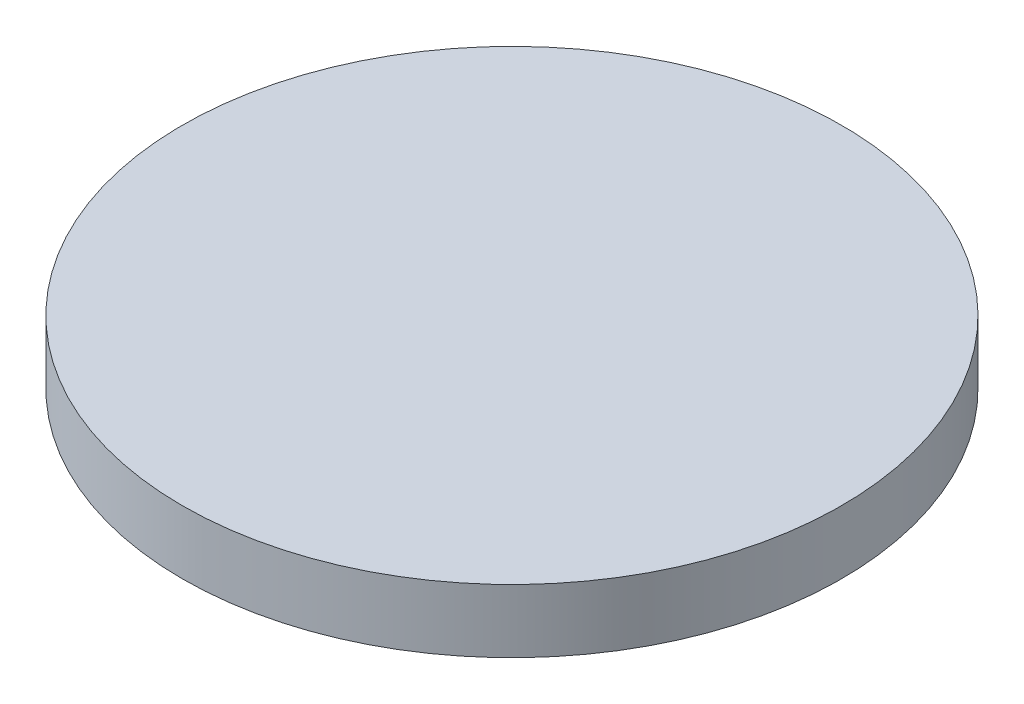
ISO-10303-21;
HEADER;
FILE_DESCRIPTION(('STEP AP214'),'2;1');
FILE_NAME('part.step','',(''),(''),'','','');
FILE_SCHEMA(('AUTOMOTIVE_DESIGN { 1 0 10303 214 1 1 1 1 }'));
ENDSEC;
DATA;
#1=APPLICATION_CONTEXT('core data for automotive mechanical design processes');
#2=APPLICATION_PROTOCOL_DEFINITION('international standard','automotive_design',2000,#1);
#3=PRODUCT_CONTEXT('',#1,'mechanical');
#4=PRODUCT('Part','Part','',(#3));
#5=PRODUCT_RELATED_PRODUCT_CATEGORY('part','',(#4));
#6=PRODUCT_DEFINITION_FORMATION('','',#4);
#7=PRODUCT_DEFINITION_CONTEXT('part definition',#1,'design');
#8=PRODUCT_DEFINITION('design','',#6,#7);
#9=PRODUCT_DEFINITION_SHAPE('','',#8);
#10=(LENGTH_UNIT() NAMED_UNIT(*) SI_UNIT(.MILLI.,.METRE.));
#11=(NAMED_UNIT(*) PLANE_ANGLE_UNIT() SI_UNIT($,.RADIAN.));
#12=(NAMED_UNIT(*) SI_UNIT($,.STERADIAN.) SOLID_ANGLE_UNIT());
#13=UNCERTAINTY_MEASURE_WITH_UNIT(LENGTH_MEASURE(1.E-05),#10,'distance_accuracy_value','');
#14=(GEOMETRIC_REPRESENTATION_CONTEXT(3) GLOBAL_UNCERTAINTY_ASSIGNED_CONTEXT((#13)) GLOBAL_UNIT_ASSIGNED_CONTEXT((#10,
#11,#12)) REPRESENTATION_CONTEXT('',''));
#15=CARTESIAN_POINT('',(0.,0.,0.));
#16=DIRECTION('',(0.,0.,1.));
#17=DIRECTION('',(1.,0.,0.));
#18=AXIS2_PLACEMENT_3D('',#15,#16,#17);
#19=CARTESIAN_POINT('',(0.,16.4,0.));
#20=DIRECTION('',(0.,-1.,0.));
#21=DIRECTION('',(0.,0.,-1.));
#22=AXIS2_PLACEMENT_3D('',#19,#20,#21);
#23=CYLINDRICAL_SURFACE('',#22,26.);
#24=CARTESIAN_POINT('',(0.,16.4,0.));
#25=DIRECTION('',(0.,1.,0.));
#26=DIRECTION('',(0.,0.,1.));
#27=AXIS2_PLACEMENT_3D('',#24,#25,#26);
#28=CIRCLE('',#27,26.);
#29=CARTESIAN_POINT('',(0.,16.4,26.));
#30=VERTEX_POINT('',#29);
#31=EDGE_CURVE('E11',#30,#30,#28,.T.);
#32=ORIENTED_EDGE('',*,*,#31,.F.);
#33=EDGE_LOOP('',(#32));
#34=FACE_BOUND('',#33,.T.);
#35=CARTESIAN_POINT('',(0.,11.4,0.));
#36=DIRECTION('',(0.,1.,0.));
#37=DIRECTION('',(0.,0.,1.));
#38=AXIS2_PLACEMENT_3D('',#35,#36,#37);
#39=CIRCLE('',#38,26.);
#40=CARTESIAN_POINT('',(0.,11.4,26.));
#41=VERTEX_POINT('',#40);
#42=EDGE_CURVE('E52',#41,#41,#39,.T.);
#43=ORIENTED_EDGE('',*,*,#42,.T.);
#44=EDGE_LOOP('',(#43));
#45=FACE_BOUND('',#44,.T.);
#46=ADVANCED_FACE('F49',(#34,#45),#23,.T.);
#47=CARTESIAN_POINT('',(0.,16.4,0.));
#48=DIRECTION('',(0.,1.,0.));
#49=DIRECTION('',(0.,0.,1.));
#50=AXIS2_PLACEMENT_3D('',#47,#48,#49);
#51=PLANE('',#50);
#52=ORIENTED_EDGE('',*,*,#31,.T.);
#53=EDGE_LOOP('',(#52));
#54=FACE_BOUND('',#53,.T.);
#55=ADVANCED_FACE('F64',(#54),#51,.T.);
#56=CARTESIAN_POINT('',(0.,11.4,0.));
#57=DIRECTION('',(0.,1.,0.));
#58=DIRECTION('',(0.,0.,1.));
#59=AXIS2_PLACEMENT_3D('',#56,#57,#58);
#60=PLANE('',#59);
#61=ORIENTED_EDGE('',*,*,#42,.F.);
#62=EDGE_LOOP('',(#61));
#63=FACE_BOUND('',#62,.T.);
#64=ADVANCED_FACE('F62',(#63),#60,.F.);
#65=CLOSED_SHELL('',(#46,#55,#64));
#66=MANIFOLD_SOLID_BREP('B2',#65);
#67=CARTESIAN_POINT('',(0.,2.,0.));
#68=DIRECTION('',(0.,1.,0.));
#69=DIRECTION('',(0.,0.,1.));
#70=AXIS2_PLACEMENT_3D('',#67,#68,#69);
#71=PLANE('',#70);
#72=CARTESIAN_POINT('',(0.,2.,0.));
#73=DIRECTION('',(0.,1.,0.));
#74=DIRECTION('',(0.,0.,1.));
#75=AXIS2_PLACEMENT_3D('',#72,#73,#74);
#76=CIRCLE('',#75,3.);
#77=CARTESIAN_POINT('',(0.,2.,3.));
#78=VERTEX_POINT('',#77);
#79=EDGE_CURVE('E141',#78,#78,#76,.T.);
#80=ORIENTED_EDGE('',*,*,#79,.F.);
#81=EDGE_LOOP('',(#80));
#82=FACE_BOUND('',#81,.T.);
#83=CARTESIAN_POINT('',(0.,2.,4.5));
#84=DIRECTION('',(0.,1.,0.));
#85=DIRECTION('',(0.,0.,-1.));
#86=AXIS2_PLACEMENT_3D('',#83,#84,#85);
#87=CIRCLE('',#86,1.);
#88=CARTESIAN_POINT('',(0.,2.,3.5));
#89=VERTEX_POINT('',#88);
#90=EDGE_CURVE('E126',#89,#89,#87,.T.);
#91=ORIENTED_EDGE('',*,*,#90,.F.);
#92=EDGE_LOOP('',(#91));
#93=FACE_BOUND('',#92,.T.);
#94=CARTESIAN_POINT('',(0.,2.,-4.5));
#95=DIRECTION('',(0.,1.,0.));
#96=DIRECTION('',(0.,0.,1.));
#97=AXIS2_PLACEMENT_3D('',#94,#95,#96);
#98=CIRCLE('',#97,1.);
#99=CARTESIAN_POINT('',(0.,2.,-3.5));
#100=VERTEX_POINT('',#99);
#101=EDGE_CURVE('E114',#100,#100,#98,.T.);
#102=ORIENTED_EDGE('',*,*,#101,.F.);
#103=EDGE_LOOP('',(#102));
#104=FACE_BOUND('',#103,.T.);
#105=CARTESIAN_POINT('',(0.,2.,0.));
#106=DIRECTION('',(0.,1.,0.));
#107=DIRECTION('',(0.,0.,1.));
#108=AXIS2_PLACEMENT_3D('',#105,#106,#107);
#109=CIRCLE('',#108,6.);
#110=CARTESIAN_POINT('',(0.,2.,6.));
#111=VERTEX_POINT('',#110);
#112=EDGE_CURVE('E110',#111,#111,#109,.T.);
#113=ORIENTED_EDGE('',*,*,#112,.T.);
#114=EDGE_LOOP('',(#113));
#115=FACE_BOUND('',#114,.T.);
#116=CARTESIAN_POINT('',(-4.5,2.,0.));
#117=DIRECTION('',(0.,1.,0.));
#118=DIRECTION('',(0.,0.,1.));
#119=AXIS2_PLACEMENT_3D('',#116,#117,#118);
#120=CIRCLE('',#119,1.);
#121=CARTESIAN_POINT('',(-4.5,2.,1.));
#122=VERTEX_POINT('',#121);
#123=EDGE_CURVE('E120',#122,#122,#120,.T.);
#124=ORIENTED_EDGE('',*,*,#123,.F.);
#125=EDGE_LOOP('',(#124));
#126=FACE_BOUND('',#125,.T.);
#127=CARTESIAN_POINT('',(4.5,2.,0.));
#128=DIRECTION('',(0.,1.,0.));
#129=DIRECTION('',(0.,0.,-1.));
#130=AXIS2_PLACEMENT_3D('',#127,#128,#129);
#131=CIRCLE('',#130,1.);
#132=CARTESIAN_POINT('',(4.5,2.,-1.));
#133=VERTEX_POINT('',#132);
#134=EDGE_CURVE('E132',#133,#133,#131,.T.);
#135=ORIENTED_EDGE('',*,*,#134,.F.);
#136=EDGE_LOOP('',(#135));
#137=FACE_BOUND('',#136,.T.);
#138=ADVANCED_FACE('F90',(#82,#93,#104,#115,#126,#137),#71,.T.);
#139=CARTESIAN_POINT('',(0.,0.,0.));
#140=DIRECTION('',(0.,1.,0.));
#141=DIRECTION('',(0.,0.,1.));
#142=AXIS2_PLACEMENT_3D('',#139,#140,#141);
#143=PLANE('',#142);
#144=CARTESIAN_POINT('',(0.,0.,0.));
#145=DIRECTION('',(0.,1.,0.));
#146=DIRECTION('',(0.,0.,1.));
#147=AXIS2_PLACEMENT_3D('',#144,#145,#146);
#148=CIRCLE('',#147,6.);
#149=CARTESIAN_POINT('',(0.,0.,6.));
#150=VERTEX_POINT('',#149);
#151=EDGE_CURVE('E111',#150,#150,#148,.T.);
#152=ORIENTED_EDGE('',*,*,#151,.F.);
#153=EDGE_LOOP('',(#152));
#154=FACE_BOUND('',#153,.T.);
#155=CARTESIAN_POINT('',(0.,0.,-4.5));
#156=DIRECTION('',(0.,1.,0.));
#157=DIRECTION('',(0.,0.,1.));
#158=AXIS2_PLACEMENT_3D('',#155,#156,#157);
#159=CIRCLE('',#158,1.);
#160=CARTESIAN_POINT('',(0.,0.,-3.5));
#161=VERTEX_POINT('',#160);
#162=EDGE_CURVE('E117',#161,#161,#159,.T.);
#163=ORIENTED_EDGE('',*,*,#162,.T.);
#164=EDGE_LOOP('',(#163));
#165=FACE_BOUND('',#164,.T.);
#166=CARTESIAN_POINT('',(-4.5,0.,0.));
#167=DIRECTION('',(0.,1.,0.));
#168=DIRECTION('',(0.,0.,1.));
#169=AXIS2_PLACEMENT_3D('',#166,#167,#168);
#170=CIRCLE('',#169,1.);
#171=CARTESIAN_POINT('',(-4.5,0.,1.));
#172=VERTEX_POINT('',#171);
#173=EDGE_CURVE('E123',#172,#172,#170,.T.);
#174=ORIENTED_EDGE('',*,*,#173,.T.);
#175=EDGE_LOOP('',(#174));
#176=FACE_BOUND('',#175,.T.);
#177=CARTESIAN_POINT('',(0.,0.,4.5));
#178=DIRECTION('',(0.,1.,0.));
#179=DIRECTION('',(0.,0.,-1.));
#180=AXIS2_PLACEMENT_3D('',#177,#178,#179);
#181=CIRCLE('',#180,1.);
#182=CARTESIAN_POINT('',(0.,0.,3.5));
#183=VERTEX_POINT('',#182);
#184=EDGE_CURVE('E129',#183,#183,#181,.T.);
#185=ORIENTED_EDGE('',*,*,#184,.T.);
#186=EDGE_LOOP('',(#185));
#187=FACE_BOUND('',#186,.T.);
#188=CARTESIAN_POINT('',(4.5,0.,0.));
#189=DIRECTION('',(0.,1.,0.));
#190=DIRECTION('',(0.,0.,-1.));
#191=AXIS2_PLACEMENT_3D('',#188,#189,#190);
#192=CIRCLE('',#191,1.);
#193=CARTESIAN_POINT('',(4.5,0.,-1.));
#194=VERTEX_POINT('',#193);
#195=EDGE_CURVE('E135',#194,#194,#192,.T.);
#196=ORIENTED_EDGE('',*,*,#195,.T.);
#197=EDGE_LOOP('',(#196));
#198=FACE_BOUND('',#197,.T.);
#199=ADVANCED_FACE('F217',(#154,#165,#176,#187,#198),#143,.F.);
#200=CARTESIAN_POINT('',(0.,2.,0.));
#201=DIRECTION('',(0.,-1.,0.));
#202=DIRECTION('',(0.,0.,-1.));
#203=AXIS2_PLACEMENT_3D('',#200,#201,#202);
#204=CYLINDRICAL_SURFACE('',#203,6.);
#205=ORIENTED_EDGE('',*,*,#112,.F.);
#206=EDGE_LOOP('',(#205));
#207=FACE_BOUND('',#206,.T.);
#208=ORIENTED_EDGE('',*,*,#151,.T.);
#209=EDGE_LOOP('',(#208));
#210=FACE_BOUND('',#209,.T.);
#211=ADVANCED_FACE('F224',(#207,#210),#204,.T.);
#212=CARTESIAN_POINT('',(0.,2.,-4.5));
#213=DIRECTION('',(0.,-1.,0.));
#214=DIRECTION('',(0.,0.,-1.));
#215=AXIS2_PLACEMENT_3D('',#212,#213,#214);
#216=CYLINDRICAL_SURFACE('',#215,1.);
#217=ORIENTED_EDGE('',*,*,#101,.T.);
#218=EDGE_LOOP('',(#217));
#219=FACE_BOUND('',#218,.T.);
#220=ORIENTED_EDGE('',*,*,#162,.F.);
#221=EDGE_LOOP('',(#220));
#222=FACE_BOUND('',#221,.T.);
#223=ADVANCED_FACE('F230',(#219,#222),#216,.F.);
#224=CARTESIAN_POINT('',(-4.5,2.,0.));
#225=DIRECTION('',(0.,-1.,0.));
#226=DIRECTION('',(0.,0.,-1.));
#227=AXIS2_PLACEMENT_3D('',#224,#225,#226);
#228=CYLINDRICAL_SURFACE('',#227,1.);
#229=ORIENTED_EDGE('',*,*,#123,.T.);
#230=EDGE_LOOP('',(#229));
#231=FACE_BOUND('',#230,.T.);
#232=ORIENTED_EDGE('',*,*,#173,.F.);
#233=EDGE_LOOP('',(#232));
#234=FACE_BOUND('',#233,.T.);
#235=ADVANCED_FACE('F237',(#231,#234),#228,.F.);
#236=CARTESIAN_POINT('',(0.,2.,4.5));
#237=DIRECTION('',(0.,-1.,0.));
#238=DIRECTION('',(0.,0.,-1.));
#239=AXIS2_PLACEMENT_3D('',#236,#237,#238);
#240=CYLINDRICAL_SURFACE('',#239,1.);
#241=ORIENTED_EDGE('',*,*,#90,.T.);
#242=EDGE_LOOP('',(#241));
#243=FACE_BOUND('',#242,.T.);
#244=ORIENTED_EDGE('',*,*,#184,.F.);
#245=EDGE_LOOP('',(#244));
#246=FACE_BOUND('',#245,.T.);
#247=ADVANCED_FACE('F253',(#243,#246),#240,.F.);
#248=CARTESIAN_POINT('',(4.5,2.,0.));
#249=DIRECTION('',(0.,-1.,0.));
#250=DIRECTION('',(0.,0.,-1.));
#251=AXIS2_PLACEMENT_3D('',#248,#249,#250);
#252=CYLINDRICAL_SURFACE('',#251,1.);
#253=ORIENTED_EDGE('',*,*,#134,.T.);
#254=EDGE_LOOP('',(#253));
#255=FACE_BOUND('',#254,.T.);
#256=ORIENTED_EDGE('',*,*,#195,.F.);
#257=EDGE_LOOP('',(#256));
#258=FACE_BOUND('',#257,.T.);
#259=ADVANCED_FACE('F251',(#255,#258),#252,.F.);
#260=CARTESIAN_POINT('',(0.,5.,0.));
#261=DIRECTION('',(0.,-1.,0.));
#262=DIRECTION('',(0.,0.,-1.));
#263=AXIS2_PLACEMENT_3D('',#260,#261,#262);
#264=CYLINDRICAL_SURFACE('',#263,3.);
#265=CARTESIAN_POINT('',(0.,5.,0.));
#266=DIRECTION('',(0.,1.,0.));
#267=DIRECTION('',(0.,0.,1.));
#268=AXIS2_PLACEMENT_3D('',#265,#266,#267);
#269=CIRCLE('',#268,3.);
#270=CARTESIAN_POINT('',(0.,5.,3.));
#271=VERTEX_POINT('',#270);
#272=EDGE_CURVE('E138',#271,#271,#269,.T.);
#273=ORIENTED_EDGE('',*,*,#272,.F.);
#274=EDGE_LOOP('',(#273));
#275=FACE_BOUND('',#274,.T.);
#276=ORIENTED_EDGE('',*,*,#79,.T.);
#277=EDGE_LOOP('',(#276));
#278=FACE_BOUND('',#277,.T.);
#279=ADVANCED_FACE('F252',(#275,#278),#264,.T.);
#280=CARTESIAN_POINT('',(0.,11.4,0.));
#281=DIRECTION('',(0.,-1.,0.));
#282=DIRECTION('',(0.,0.,-1.));
#283=AXIS2_PLACEMENT_3D('',#280,#281,#282);
#284=CYLINDRICAL_SURFACE('',#283,8.25);
#285=CARTESIAN_POINT('',(0.,5.5,0.));
#286=DIRECTION('',(0.,1.,0.));
#287=DIRECTION('',(0.,0.,1.));
#288=AXIS2_PLACEMENT_3D('',#285,#286,#287);
#289=CIRCLE('',#288,8.25);
#290=CARTESIAN_POINT('',(0.,5.5,8.25));
#291=VERTEX_POINT('',#290);
#292=EDGE_CURVE('E97',#291,#291,#289,.T.);
#293=ORIENTED_EDGE('',*,*,#292,.T.);
#294=EDGE_LOOP('',(#293));
#295=FACE_BOUND('',#294,.T.);
#296=CARTESIAN_POINT('',(0.,8.4,0.));
#297=DIRECTION('',(0.,1.,0.));
#298=DIRECTION('',(0.,0.,1.));
#299=AXIS2_PLACEMENT_3D('',#296,#297,#298);
#300=CIRCLE('',#299,8.25);
#301=CARTESIAN_POINT('',(0.,8.4,8.25));
#302=VERTEX_POINT('',#301);
#303=EDGE_CURVE('E101',#302,#302,#300,.F.);
#304=ORIENTED_EDGE('',*,*,#303,.T.);
#305=EDGE_LOOP('',(#304));
#306=FACE_BOUND('',#305,.T.);
#307=ADVANCED_FACE('F190',(#295,#306),#284,.T.);
#308=CARTESIAN_POINT('',(0.,11.4,0.));
#309=DIRECTION('',(0.,1.,0.));
#310=DIRECTION('',(0.,0.,1.));
#311=AXIS2_PLACEMENT_3D('',#308,#309,#310);
#312=PLANE('',#311);
#313=CARTESIAN_POINT('',(0.,11.4,0.));
#314=DIRECTION('',(0.,1.,0.));
#315=DIRECTION('',(0.,0.,1.));
#316=AXIS2_PLACEMENT_3D('',#313,#314,#315);
#317=CIRCLE('',#316,0.8);
#318=CARTESIAN_POINT('',(0.,11.4,0.8));
#319=VERTEX_POINT('',#318);
#320=EDGE_CURVE('E171',#319,#319,#317,.T.);
#321=ORIENTED_EDGE('',*,*,#320,.F.);
#322=EDGE_LOOP('',(#321));
#323=FACE_BOUND('',#322,.T.);
#324=CARTESIAN_POINT('',(0.,11.4,-2.5));
#325=DIRECTION('',(0.,1.,0.));
#326=DIRECTION('',(0.,0.,1.));
#327=AXIS2_PLACEMENT_3D('',#324,#325,#326);
#328=CIRCLE('',#327,1.);
#329=CARTESIAN_POINT('',(0.,11.4,-1.5));
#330=VERTEX_POINT('',#329);
#331=EDGE_CURVE('E166',#330,#330,#328,.T.);
#332=ORIENTED_EDGE('',*,*,#331,.F.);
#333=EDGE_LOOP('',(#332));
#334=FACE_BOUND('',#333,.T.);
#335=CARTESIAN_POINT('',(2.5,11.4,0.));
#336=DIRECTION('',(0.,1.,0.));
#337=DIRECTION('',(0.,0.,1.));
#338=AXIS2_PLACEMENT_3D('',#335,#336,#337);
#339=CIRCLE('',#338,1.);
#340=CARTESIAN_POINT('',(2.5,11.4,1.));
#341=VERTEX_POINT('',#340);
#342=EDGE_CURVE('E163',#341,#341,#339,.T.);
#343=ORIENTED_EDGE('',*,*,#342,.F.);
#344=EDGE_LOOP('',(#343));
#345=FACE_BOUND('',#344,.T.);
#346=CARTESIAN_POINT('',(0.,11.4,2.5));
#347=DIRECTION('',(0.,1.,0.));
#348=DIRECTION('',(0.,0.,-1.));
#349=AXIS2_PLACEMENT_3D('',#346,#347,#348);
#350=CIRCLE('',#349,1.);
#351=CARTESIAN_POINT('',(0.,11.4,1.5));
#352=VERTEX_POINT('',#351);
#353=EDGE_CURVE('E157',#352,#352,#350,.T.);
#354=ORIENTED_EDGE('',*,*,#353,.F.);
#355=EDGE_LOOP('',(#354));
#356=FACE_BOUND('',#355,.T.);
#357=CARTESIAN_POINT('',(-2.5,11.4,0.));
#358=DIRECTION('',(0.,1.,0.));
#359=DIRECTION('',(0.,0.,-1.));
#360=AXIS2_PLACEMENT_3D('',#357,#358,#359);
#361=CIRCLE('',#360,1.);
#362=CARTESIAN_POINT('',(-2.5,11.4,-1.));
#363=VERTEX_POINT('',#362);
#364=EDGE_CURVE('E150',#363,#363,#361,.T.);
#365=ORIENTED_EDGE('',*,*,#364,.F.);
#366=EDGE_LOOP('',(#365));
#367=FACE_BOUND('',#366,.T.);
#368=CARTESIAN_POINT('',(0.,11.4,0.));
#369=DIRECTION('',(0.,1.,0.));
#370=DIRECTION('',(0.,0.,1.));
#371=AXIS2_PLACEMENT_3D('',#368,#369,#370);
#372=CIRCLE('',#371,5.25);
#373=CARTESIAN_POINT('',(0.,11.4,5.25));
#374=VERTEX_POINT('',#373);
#375=EDGE_CURVE('E105',#374,#374,#372,.T.);
#376=ORIENTED_EDGE('',*,*,#375,.T.);
#377=EDGE_LOOP('',(#376));
#378=FACE_BOUND('',#377,.T.);
#379=ADVANCED_FACE('F186',(#323,#334,#345,#356,#367,#378),#312,.T.);
#380=CARTESIAN_POINT('',(0.,5.,0.));
#381=DIRECTION('',(0.,1.,0.));
#382=DIRECTION('',(0.,0.,1.));
#383=AXIS2_PLACEMENT_3D('',#380,#381,#382);
#384=PLANE('',#383);
#385=CARTESIAN_POINT('',(0.,5.,0.));
#386=DIRECTION('',(0.,1.,0.));
#387=DIRECTION('',(0.,0.,1.));
#388=AXIS2_PLACEMENT_3D('',#385,#386,#387);
#389=CIRCLE('',#388,7.75);
#390=CARTESIAN_POINT('',(0.,5.,7.75));
#391=VERTEX_POINT('',#390);
#392=EDGE_CURVE('E48',#391,#391,#389,.F.);
#393=ORIENTED_EDGE('',*,*,#392,.T.);
#394=EDGE_LOOP('',(#393));
#395=FACE_BOUND('',#394,.T.);
#396=ORIENTED_EDGE('',*,*,#272,.T.);
#397=EDGE_LOOP('',(#396));
#398=FACE_BOUND('',#397,.T.);
#399=ADVANCED_FACE('F189',(#395,#398),#384,.F.);
#400=CARTESIAN_POINT('',(0.,8.4,0.));
#401=DIRECTION('',(0.,1.,0.));
#402=DIRECTION('',(0.,0.,1.));
#403=AXIS2_PLACEMENT_3D('',#400,#401,#402);
#404=TOROIDAL_SURFACE('',#403,5.25,3.);
#405=ORIENTED_EDGE('',*,*,#303,.F.);
#406=EDGE_LOOP('',(#405));
#407=FACE_BOUND('',#406,.T.);
#408=ORIENTED_EDGE('',*,*,#375,.F.);
#409=EDGE_LOOP('',(#408));
#410=FACE_BOUND('',#409,.T.);
#411=ADVANCED_FACE('F202',(#407,#410),#404,.T.);
#412=CARTESIAN_POINT('',(0.,5.5,0.));
#413=DIRECTION('',(0.,1.,0.));
#414=DIRECTION('',(0.,0.,1.));
#415=AXIS2_PLACEMENT_3D('',#412,#413,#414);
#416=TOROIDAL_SURFACE('',#415,7.75,0.5);
#417=ORIENTED_EDGE('',*,*,#392,.F.);
#418=EDGE_LOOP('',(#417));
#419=FACE_BOUND('',#418,.T.);
#420=ORIENTED_EDGE('',*,*,#292,.F.);
#421=EDGE_LOOP('',(#420));
#422=FACE_BOUND('',#421,.T.);
#423=ADVANCED_FACE('F92',(#419,#422),#416,.T.);
#424=CARTESIAN_POINT('',(-2.5,6.4,0.));
#425=DIRECTION('',(0.,1.,0.));
#426=DIRECTION('',(0.,0.,1.));
#427=AXIS2_PLACEMENT_3D('',#424,#425,#426);
#428=CYLINDRICAL_SURFACE('',#427,1.);
#429=CARTESIAN_POINT('',(-2.5,6.4,0.));
#430=DIRECTION('',(0.,1.,0.));
#431=DIRECTION('',(0.,0.,-1.));
#432=AXIS2_PLACEMENT_3D('',#429,#430,#431);
#433=CIRCLE('',#432,1.);
#434=CARTESIAN_POINT('',(-2.5,6.4,-1.));
#435=VERTEX_POINT('',#434);
#436=EDGE_CURVE('E147',#435,#435,#433,.T.);
#437=ORIENTED_EDGE('',*,*,#436,.F.);
#438=EDGE_LOOP('',(#437));
#439=FACE_BOUND('',#438,.T.);
#440=ORIENTED_EDGE('',*,*,#364,.T.);
#441=EDGE_LOOP('',(#440));
#442=FACE_BOUND('',#441,.T.);
#443=ADVANCED_FACE('F210',(#439,#442),#428,.F.);
#444=CARTESIAN_POINT('',(-2.5,6.4,0.));
#445=DIRECTION('',(0.,-1.,0.));
#446=DIRECTION('',(0.,0.,-1.));
#447=AXIS2_PLACEMENT_3D('',#444,#445,#446);
#448=PLANE('',#447);
#449=ORIENTED_EDGE('',*,*,#436,.T.);
#450=EDGE_LOOP('',(#449));
#451=FACE_BOUND('',#450,.T.);
#452=ADVANCED_FACE('F329',(#451),#448,.F.);
#453=CARTESIAN_POINT('',(0.,6.4,2.5));
#454=DIRECTION('',(0.,1.,0.));
#455=DIRECTION('',(0.,0.,1.));
#456=AXIS2_PLACEMENT_3D('',#453,#454,#455);
#457=CYLINDRICAL_SURFACE('',#456,1.);
#458=CARTESIAN_POINT('',(0.,6.4,2.5));
#459=DIRECTION('',(0.,1.,0.));
#460=DIRECTION('',(0.,0.,-1.));
#461=AXIS2_PLACEMENT_3D('',#458,#459,#460);
#462=CIRCLE('',#461,1.);
#463=CARTESIAN_POINT('',(0.,6.4,1.5));
#464=VERTEX_POINT('',#463);
#465=EDGE_CURVE('E154',#464,#464,#462,.T.);
#466=ORIENTED_EDGE('',*,*,#465,.F.);
#467=EDGE_LOOP('',(#466));
#468=FACE_BOUND('',#467,.T.);
#469=ORIENTED_EDGE('',*,*,#353,.T.);
#470=EDGE_LOOP('',(#469));
#471=FACE_BOUND('',#470,.T.);
#472=ADVANCED_FACE('F339',(#468,#471),#457,.F.);
#473=CARTESIAN_POINT('',(0.,6.4,2.5));
#474=DIRECTION('',(0.,-1.,0.));
#475=DIRECTION('',(0.,0.,-1.));
#476=AXIS2_PLACEMENT_3D('',#473,#474,#475);
#477=PLANE('',#476);
#478=ORIENTED_EDGE('',*,*,#465,.T.);
#479=EDGE_LOOP('',(#478));
#480=FACE_BOUND('',#479,.T.);
#481=ADVANCED_FACE('F349',(#480),#477,.F.);
#482=CARTESIAN_POINT('',(2.5,6.4,0.));
#483=DIRECTION('',(0.,1.,0.));
#484=DIRECTION('',(0.,0.,1.));
#485=AXIS2_PLACEMENT_3D('',#482,#483,#484);
#486=CYLINDRICAL_SURFACE('',#485,1.);
#487=CARTESIAN_POINT('',(2.5,6.4,0.));
#488=DIRECTION('',(0.,1.,0.));
#489=DIRECTION('',(0.,0.,1.));
#490=AXIS2_PLACEMENT_3D('',#487,#488,#489);
#491=CIRCLE('',#490,1.);
#492=CARTESIAN_POINT('',(2.5,6.4,1.));
#493=VERTEX_POINT('',#492);
#494=EDGE_CURVE('E160',#493,#493,#491,.T.);
#495=ORIENTED_EDGE('',*,*,#494,.F.);
#496=EDGE_LOOP('',(#495));
#497=FACE_BOUND('',#496,.T.);
#498=ORIENTED_EDGE('',*,*,#342,.T.);
#499=EDGE_LOOP('',(#498));
#500=FACE_BOUND('',#499,.T.);
#501=ADVANCED_FACE('F359',(#497,#500),#486,.F.);
#502=CARTESIAN_POINT('',(2.5,6.4,0.));
#503=DIRECTION('',(0.,1.,0.));
#504=DIRECTION('',(0.,0.,1.));
#505=AXIS2_PLACEMENT_3D('',#502,#503,#504);
#506=PLANE('',#505);
#507=ORIENTED_EDGE('',*,*,#494,.T.);
#508=EDGE_LOOP('',(#507));
#509=FACE_BOUND('',#508,.T.);
#510=ADVANCED_FACE('F369',(#509),#506,.T.);
#511=CARTESIAN_POINT('',(0.,6.4,-2.5));
#512=DIRECTION('',(0.,1.,0.));
#513=DIRECTION('',(0.,0.,1.));
#514=AXIS2_PLACEMENT_3D('',#511,#512,#513);
#515=CYLINDRICAL_SURFACE('',#514,1.);
#516=CARTESIAN_POINT('',(0.,6.4,-2.5));
#517=DIRECTION('',(0.,1.,0.));
#518=DIRECTION('',(0.,0.,1.));
#519=AXIS2_PLACEMENT_3D('',#516,#517,#518);
#520=CIRCLE('',#519,1.);
#521=CARTESIAN_POINT('',(0.,6.4,-1.5));
#522=VERTEX_POINT('',#521);
#523=EDGE_CURVE('E144',#522,#522,#520,.T.);
#524=ORIENTED_EDGE('',*,*,#523,.F.);
#525=EDGE_LOOP('',(#524));
#526=FACE_BOUND('',#525,.T.);
#527=ORIENTED_EDGE('',*,*,#331,.T.);
#528=EDGE_LOOP('',(#527));
#529=FACE_BOUND('',#528,.T.);
#530=ADVANCED_FACE('F379',(#526,#529),#515,.F.);
#531=CARTESIAN_POINT('',(0.,6.4,-2.5));
#532=DIRECTION('',(0.,1.,0.));
#533=DIRECTION('',(0.,0.,1.));
#534=AXIS2_PLACEMENT_3D('',#531,#532,#533);
#535=PLANE('',#534);
#536=ORIENTED_EDGE('',*,*,#523,.T.);
#537=EDGE_LOOP('',(#536));
#538=FACE_BOUND('',#537,.T.);
#539=ADVANCED_FACE('F182',(#538),#535,.T.);
#540=CARTESIAN_POINT('',(0.,15.4,0.));
#541=DIRECTION('',(0.,-1.,0.));
#542=DIRECTION('',(0.,0.,-1.));
#543=AXIS2_PLACEMENT_3D('',#540,#541,#542);
#544=CYLINDRICAL_SURFACE('',#543,0.8);
#545=CARTESIAN_POINT('',(0.,15.4,0.));
#546=DIRECTION('',(0.,1.,0.));
#547=DIRECTION('',(0.,0.,1.));
#548=AXIS2_PLACEMENT_3D('',#545,#546,#547);
#549=CIRCLE('',#548,0.8);
#550=CARTESIAN_POINT('',(0.,15.4,0.8));
#551=VERTEX_POINT('',#550);
#552=EDGE_CURVE('E151',#551,#551,#549,.T.);
#553=ORIENTED_EDGE('',*,*,#552,.F.);
#554=EDGE_LOOP('',(#553));
#555=FACE_BOUND('',#554,.T.);
#556=ORIENTED_EDGE('',*,*,#320,.T.);
#557=EDGE_LOOP('',(#556));
#558=FACE_BOUND('',#557,.T.);
#559=ADVANCED_FACE('F179',(#555,#558),#544,.T.);
#560=CARTESIAN_POINT('',(0.,15.4,0.));
#561=DIRECTION('',(0.,1.,0.));
#562=DIRECTION('',(0.,0.,1.));
#563=AXIS2_PLACEMENT_3D('',#560,#561,#562);
#564=PLANE('',#563);
#565=ORIENTED_EDGE('',*,*,#552,.T.);
#566=EDGE_LOOP('',(#565));
#567=FACE_BOUND('',#566,.T.);
#568=ADVANCED_FACE('F177',(#567),#564,.T.);
#569=CLOSED_SHELL('',(#138,#199,#211,#223,#235,#247,#259,#279,#307,#379,#399,#411,#423,#443,
#452,#472,#481,#501,#510,#530,#539,#559,#568));
#570=MANIFOLD_SOLID_BREP('B6',#569);
#571=ADVANCED_BREP_SHAPE_REPRESENTATION('',(#18,#66,#570),#14);
#572=SHAPE_DEFINITION_REPRESENTATION(#9,#571);
ENDSEC;
END-ISO-10303-21;
